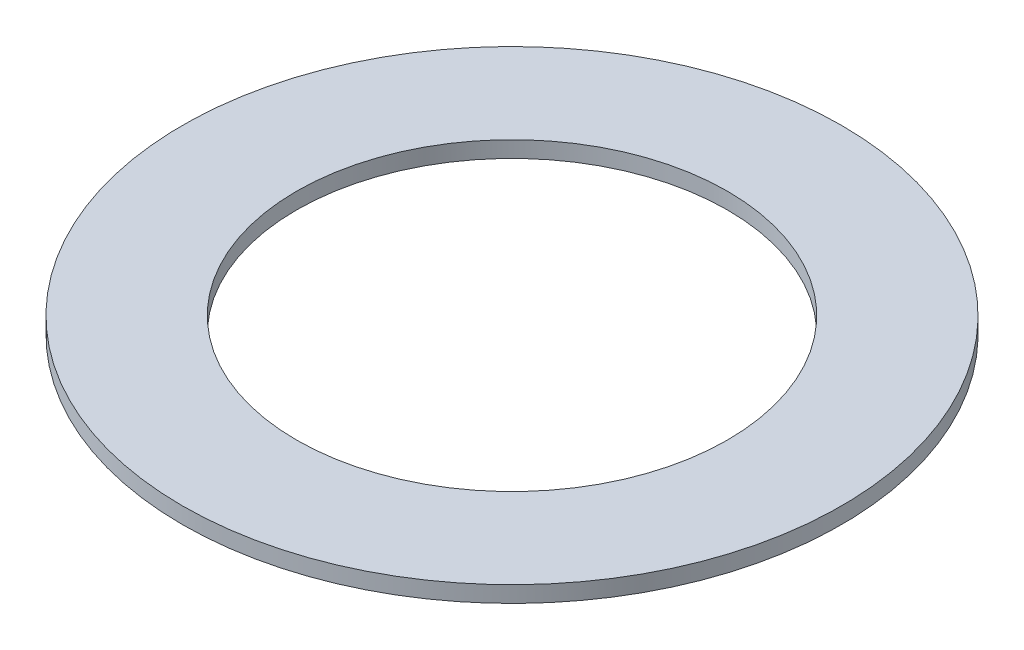
ISO-10303-21;
HEADER;
FILE_DESCRIPTION(('STEP AP214'),'2;1');
FILE_NAME('part.step','',(''),(''),'','','');
FILE_SCHEMA(('AUTOMOTIVE_DESIGN { 1 0 10303 214 1 1 1 1 }'));
ENDSEC;
DATA;
#1=APPLICATION_CONTEXT('core data for automotive mechanical design processes');
#2=APPLICATION_PROTOCOL_DEFINITION('international standard','automotive_design',2000,#1);
#3=PRODUCT_CONTEXT('',#1,'mechanical');
#4=PRODUCT('Part','Part','',(#3));
#5=PRODUCT_RELATED_PRODUCT_CATEGORY('part','',(#4));
#6=PRODUCT_DEFINITION_FORMATION('','',#4);
#7=PRODUCT_DEFINITION_CONTEXT('part definition',#1,'design');
#8=PRODUCT_DEFINITION('design','',#6,#7);
#9=PRODUCT_DEFINITION_SHAPE('','',#8);
#10=(LENGTH_UNIT() NAMED_UNIT(*) SI_UNIT(.MILLI.,.METRE.));
#11=(NAMED_UNIT(*) PLANE_ANGLE_UNIT() SI_UNIT($,.RADIAN.));
#12=(NAMED_UNIT(*) SI_UNIT($,.STERADIAN.) SOLID_ANGLE_UNIT());
#13=UNCERTAINTY_MEASURE_WITH_UNIT(LENGTH_MEASURE(1.E-05),#10,'distance_accuracy_value','');
#14=(GEOMETRIC_REPRESENTATION_CONTEXT(3) GLOBAL_UNCERTAINTY_ASSIGNED_CONTEXT((#13)) GLOBAL_UNIT_ASSIGNED_CONTEXT((#10,
#11,#12)) REPRESENTATION_CONTEXT('',''));
#15=CARTESIAN_POINT('',(0.,0.,0.));
#16=DIRECTION('',(0.,0.,1.));
#17=DIRECTION('',(1.,0.,0.));
#18=AXIS2_PLACEMENT_3D('',#15,#16,#17);
#19=CARTESIAN_POINT('',(0.,3.,0.));
#20=DIRECTION('',(0.,1.,0.));
#21=DIRECTION('',(0.,0.,1.));
#22=AXIS2_PLACEMENT_3D('',#19,#20,#21);
#23=PLANE('',#22);
#24=CARTESIAN_POINT('',(0.,3.,0.));
#25=DIRECTION('',(0.,1.,0.));
#26=DIRECTION('',(0.,0.,1.));
#27=AXIS2_PLACEMENT_3D('',#24,#25,#26);
#28=CIRCLE('',#27,60.8079711842216);
#29=CARTESIAN_POINT('',(0.,3.,60.8079711842216));
#30=VERTEX_POINT('',#29);
#31=EDGE_CURVE('E10',#30,#30,#28,.T.);
#32=ORIENTED_EDGE('',*,*,#31,.T.);
#33=EDGE_LOOP('',(#32));
#34=FACE_BOUND('',#33,.T.);
#35=CARTESIAN_POINT('',(0.,3.,0.));
#36=DIRECTION('',(0.,1.,0.));
#37=DIRECTION('',(0.,0.,1.));
#38=AXIS2_PLACEMENT_3D('',#35,#36,#37);
#39=CIRCLE('',#38,39.7621006177945);
#40=CARTESIAN_POINT('',(0.,3.,39.7621006177945));
#41=VERTEX_POINT('',#40);
#42=EDGE_CURVE('E42',#41,#41,#39,.T.);
#43=ORIENTED_EDGE('',*,*,#42,.F.);
#44=EDGE_LOOP('',(#43));
#45=FACE_BOUND('',#44,.T.);
#46=ADVANCED_FACE('F31',(#34,#45),#23,.T.);
#47=CARTESIAN_POINT('',(0.,0.,0.));
#48=DIRECTION('',(0.,1.,0.));
#49=DIRECTION('',(0.,0.,1.));
#50=AXIS2_PLACEMENT_3D('',#47,#48,#49);
#51=PLANE('',#50);
#52=CARTESIAN_POINT('',(0.,0.,0.));
#53=DIRECTION('',(0.,1.,0.));
#54=DIRECTION('',(0.,0.,1.));
#55=AXIS2_PLACEMENT_3D('',#52,#53,#54);
#56=CIRCLE('',#55,60.8079711842216);
#57=CARTESIAN_POINT('',(0.,0.,60.8079711842216));
#58=VERTEX_POINT('',#57);
#59=EDGE_CURVE('E35',#58,#58,#56,.T.);
#60=ORIENTED_EDGE('',*,*,#59,.F.);
#61=EDGE_LOOP('',(#60));
#62=FACE_BOUND('',#61,.T.);
#63=CARTESIAN_POINT('',(0.,0.,0.));
#64=DIRECTION('',(0.,1.,0.));
#65=DIRECTION('',(0.,0.,1.));
#66=AXIS2_PLACEMENT_3D('',#63,#64,#65);
#67=CIRCLE('',#66,39.7621006177945);
#68=CARTESIAN_POINT('',(0.,0.,39.7621006177945));
#69=VERTEX_POINT('',#68);
#70=EDGE_CURVE('E44',#69,#69,#67,.T.);
#71=ORIENTED_EDGE('',*,*,#70,.T.);
#72=EDGE_LOOP('',(#71));
#73=FACE_BOUND('',#72,.T.);
#74=ADVANCED_FACE('F54',(#62,#73),#51,.F.);
#75=CARTESIAN_POINT('',(0.,3.,0.));
#76=DIRECTION('',(0.,-1.,0.));
#77=DIRECTION('',(0.,0.,-1.));
#78=AXIS2_PLACEMENT_3D('',#75,#76,#77);
#79=CYLINDRICAL_SURFACE('',#78,60.8079711842216);
#80=ORIENTED_EDGE('',*,*,#31,.F.);
#81=EDGE_LOOP('',(#80));
#82=FACE_BOUND('',#81,.T.);
#83=ORIENTED_EDGE('',*,*,#59,.T.);
#84=EDGE_LOOP('',(#83));
#85=FACE_BOUND('',#84,.T.);
#86=ADVANCED_FACE('F33',(#82,#85),#79,.T.);
#87=CARTESIAN_POINT('',(0.,3.,0.));
#88=DIRECTION('',(0.,-1.,0.));
#89=DIRECTION('',(0.,0.,-1.));
#90=AXIS2_PLACEMENT_3D('',#87,#88,#89);
#91=CYLINDRICAL_SURFACE('',#90,39.7621006177945);
#92=ORIENTED_EDGE('',*,*,#42,.T.);
#93=EDGE_LOOP('',(#92));
#94=FACE_BOUND('',#93,.T.);
#95=ORIENTED_EDGE('',*,*,#70,.F.);
#96=EDGE_LOOP('',(#95));
#97=FACE_BOUND('',#96,.T.);
#98=ADVANCED_FACE('F50',(#94,#97),#91,.F.);
#99=CLOSED_SHELL('',(#46,#74,#86,#98));
#100=MANIFOLD_SOLID_BREP('B2',#99);
#101=ADVANCED_BREP_SHAPE_REPRESENTATION('',(#18,#100),#14);
#102=SHAPE_DEFINITION_REPRESENTATION(#9,#101);
ENDSEC;
END-ISO-10303-21;
